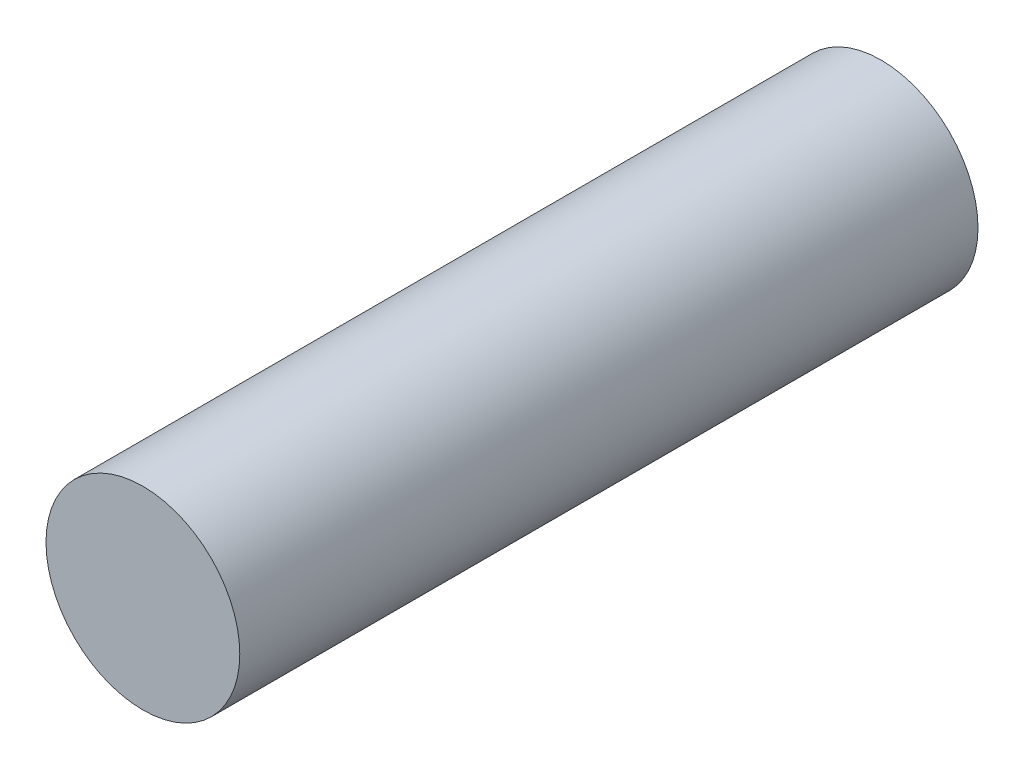
ISO-10303-21;
HEADER;
FILE_DESCRIPTION(('STEP AP214'),'2;1');
FILE_NAME('part.step','',(''),(''),'','','');
FILE_SCHEMA(('AUTOMOTIVE_DESIGN { 1 0 10303 214 1 1 1 1 }'));
ENDSEC;
DATA;
#1=APPLICATION_CONTEXT('core data for automotive mechanical design processes');
#2=APPLICATION_PROTOCOL_DEFINITION('international standard','automotive_design',2000,#1);
#3=PRODUCT_CONTEXT('',#1,'mechanical');
#4=PRODUCT('Part','Part','',(#3));
#5=PRODUCT_RELATED_PRODUCT_CATEGORY('part','',(#4));
#6=PRODUCT_DEFINITION_FORMATION('','',#4);
#7=PRODUCT_DEFINITION_CONTEXT('part definition',#1,'design');
#8=PRODUCT_DEFINITION('design','',#6,#7);
#9=PRODUCT_DEFINITION_SHAPE('','',#8);
#10=(LENGTH_UNIT() NAMED_UNIT(*) SI_UNIT(.MILLI.,.METRE.));
#11=(NAMED_UNIT(*) PLANE_ANGLE_UNIT() SI_UNIT($,.RADIAN.));
#12=(NAMED_UNIT(*) SI_UNIT($,.STERADIAN.) SOLID_ANGLE_UNIT());
#13=UNCERTAINTY_MEASURE_WITH_UNIT(LENGTH_MEASURE(1.E-05),#10,'distance_accuracy_value','');
#14=(GEOMETRIC_REPRESENTATION_CONTEXT(3) GLOBAL_UNCERTAINTY_ASSIGNED_CONTEXT((#13)) GLOBAL_UNIT_ASSIGNED_CONTEXT((#10,
#11,#12)) REPRESENTATION_CONTEXT('',''));
#15=CARTESIAN_POINT('',(0.,0.,0.));
#16=DIRECTION('',(0.,0.,1.));
#17=DIRECTION('',(1.,0.,0.));
#18=AXIS2_PLACEMENT_3D('',#15,#16,#17);
#19=CARTESIAN_POINT('',(0.,0.,40.));
#20=DIRECTION('',(0.,0.,-1.));
#21=DIRECTION('',(-1.,0.,0.));
#22=AXIS2_PLACEMENT_3D('',#19,#20,#21);
#23=CYLINDRICAL_SURFACE('',#22,5.25);
#24=CARTESIAN_POINT('',(0.,0.,40.));
#25=DIRECTION('',(0.,0.,1.));
#26=DIRECTION('',(1.,0.,0.));
#27=AXIS2_PLACEMENT_3D('',#24,#25,#26);
#28=CIRCLE('',#27,5.25);
#29=CARTESIAN_POINT('',(5.25,0.,40.));
#30=VERTEX_POINT('',#29);
#31=EDGE_CURVE('E10',#30,#30,#28,.T.);
#32=ORIENTED_EDGE('',*,*,#31,.F.);
#33=EDGE_LOOP('',(#32));
#34=FACE_BOUND('',#33,.T.);
#35=CARTESIAN_POINT('',(0.,0.,0.));
#36=DIRECTION('',(0.,0.,1.));
#37=DIRECTION('',(1.,0.,0.));
#38=AXIS2_PLACEMENT_3D('',#35,#36,#37);
#39=CIRCLE('',#38,5.25);
#40=CARTESIAN_POINT('',(5.25,0.,0.));
#41=VERTEX_POINT('',#40);
#42=EDGE_CURVE('E40',#41,#41,#39,.T.);
#43=ORIENTED_EDGE('',*,*,#42,.T.);
#44=EDGE_LOOP('',(#43));
#45=FACE_BOUND('',#44,.T.);
#46=ADVANCED_FACE('F37',(#34,#45),#23,.T.);
#47=CARTESIAN_POINT('',(0.,0.,40.));
#48=DIRECTION('',(0.,0.,1.));
#49=DIRECTION('',(1.,0.,0.));
#50=AXIS2_PLACEMENT_3D('',#47,#48,#49);
#51=PLANE('',#50);
#52=ORIENTED_EDGE('',*,*,#31,.T.);
#53=EDGE_LOOP('',(#52));
#54=FACE_BOUND('',#53,.T.);
#55=ADVANCED_FACE('F54',(#54),#51,.T.);
#56=CARTESIAN_POINT('',(0.,0.,0.));
#57=DIRECTION('',(0.,0.,1.));
#58=DIRECTION('',(1.,0.,0.));
#59=AXIS2_PLACEMENT_3D('',#56,#57,#58);
#60=PLANE('',#59);
#61=ORIENTED_EDGE('',*,*,#42,.F.);
#62=EDGE_LOOP('',(#61));
#63=FACE_BOUND('',#62,.T.);
#64=ADVANCED_FACE('F52',(#63),#60,.F.);
#65=CLOSED_SHELL('',(#46,#55,#64));
#66=MANIFOLD_SOLID_BREP('B2',#65);
#67=ADVANCED_BREP_SHAPE_REPRESENTATION('',(#18,#66),#14);
#68=SHAPE_DEFINITION_REPRESENTATION(#9,#67);
ENDSEC;
END-ISO-10303-21;
